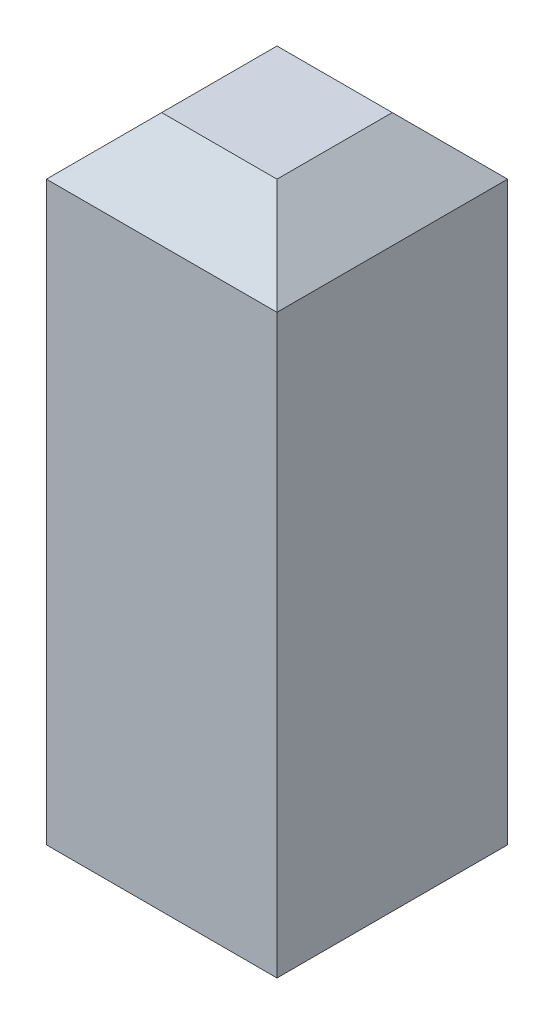
ISO-10303-21;
HEADER;
FILE_DESCRIPTION(('STEP AP214'),'2;1');
FILE_NAME('part.step','',(''),(''),'','','');
FILE_SCHEMA(('AUTOMOTIVE_DESIGN { 1 0 10303 214 1 1 1 1 }'));
ENDSEC;
DATA;
#1=APPLICATION_CONTEXT('core data for automotive mechanical design processes');
#2=APPLICATION_PROTOCOL_DEFINITION('international standard','automotive_design',2000,#1);
#3=PRODUCT_CONTEXT('',#1,'mechanical');
#4=PRODUCT('Part','Part','',(#3));
#5=PRODUCT_RELATED_PRODUCT_CATEGORY('part','',(#4));
#6=PRODUCT_DEFINITION_FORMATION('','',#4);
#7=PRODUCT_DEFINITION_CONTEXT('part definition',#1,'design');
#8=PRODUCT_DEFINITION('design','',#6,#7);
#9=PRODUCT_DEFINITION_SHAPE('','',#8);
#10=(LENGTH_UNIT() NAMED_UNIT(*) SI_UNIT(.MILLI.,.METRE.));
#11=(NAMED_UNIT(*) PLANE_ANGLE_UNIT() SI_UNIT($,.RADIAN.));
#12=(NAMED_UNIT(*) SI_UNIT($,.STERADIAN.) SOLID_ANGLE_UNIT());
#13=UNCERTAINTY_MEASURE_WITH_UNIT(LENGTH_MEASURE(1.E-05),#10,'distance_accuracy_value','');
#14=(GEOMETRIC_REPRESENTATION_CONTEXT(3) GLOBAL_UNCERTAINTY_ASSIGNED_CONTEXT((#13)) GLOBAL_UNIT_ASSIGNED_CONTEXT((#10,
#11,#12)) REPRESENTATION_CONTEXT('',''));
#15=CARTESIAN_POINT('',(0.,0.,0.));
#16=DIRECTION('',(0.,0.,1.));
#17=DIRECTION('',(1.,0.,0.));
#18=AXIS2_PLACEMENT_3D('',#15,#16,#17);
#19=CARTESIAN_POINT('',(2.,12.,2.));
#20=DIRECTION('',(-1.,0.,0.));
#21=DIRECTION('',(0.,0.,1.));
#22=AXIS2_PLACEMENT_3D('',#19,#20,#21);
#23=PLANE('',#22);
#24=DIRECTION('',(0.,-1.,0.));
#25=VECTOR('',#24,1.);
#26=CARTESIAN_POINT('',(2.,12.,2.));
#27=LINE('',#26,#25);
#28=CARTESIAN_POINT('',(2.,11.,2.));
#29=VERTEX_POINT('',#28);
#30=CARTESIAN_POINT('',(2.,0.999999999999999,2.));
#31=VERTEX_POINT('',#30);
#32=EDGE_CURVE('E170',#29,#31,#27,.T.);
#33=ORIENTED_EDGE('',*,*,#32,.T.);
#34=DIRECTION('',(0.,0.,-1.));
#35=VECTOR('',#34,1.);
#36=CARTESIAN_POINT('',(2.,0.999999999999999,-2.));
#37=LINE('',#36,#35);
#38=CARTESIAN_POINT('',(2.,0.999999999999999,-2.));
#39=VERTEX_POINT('',#38);
#40=EDGE_CURVE('E58',#31,#39,#37,.T.);
#41=ORIENTED_EDGE('',*,*,#40,.T.);
#42=DIRECTION('',(0.,-1.,0.));
#43=VECTOR('',#42,1.);
#44=CARTESIAN_POINT('',(2.,12.,-2.));
#45=LINE('',#44,#43);
#46=CARTESIAN_POINT('',(2.,11.,-2.));
#47=VERTEX_POINT('',#46);
#48=EDGE_CURVE('E138',#47,#39,#45,.T.);
#49=ORIENTED_EDGE('',*,*,#48,.F.);
#50=DIRECTION('',(0.,0.,1.));
#51=VECTOR('',#50,1.);
#52=CARTESIAN_POINT('',(2.,11.,2.));
#53=LINE('',#52,#51);
#54=EDGE_CURVE('E158',#47,#29,#53,.T.);
#55=ORIENTED_EDGE('',*,*,#54,.T.);
#56=EDGE_LOOP('',(#33,#41,#49,#55));
#57=FACE_BOUND('',#56,.T.);
#58=ADVANCED_FACE('F47',(#57),#23,.F.);
#59=CARTESIAN_POINT('',(-2.,12.,-2.));
#60=DIRECTION('',(0.,0.,1.));
#61=DIRECTION('',(1.,0.,0.));
#62=AXIS2_PLACEMENT_3D('',#59,#60,#61);
#63=PLANE('',#62);
#64=ORIENTED_EDGE('',*,*,#48,.T.);
#65=DIRECTION('',(-1.,0.,0.));
#66=VECTOR('',#65,1.);
#67=CARTESIAN_POINT('',(-2.,0.999999999999999,-2.));
#68=LINE('',#67,#66);
#69=CARTESIAN_POINT('',(-2.,0.999999999999999,-2.));
#70=VERTEX_POINT('',#69);
#71=EDGE_CURVE('E187',#39,#70,#68,.T.);
#72=ORIENTED_EDGE('',*,*,#71,.T.);
#73=DIRECTION('',(0.,-1.,0.));
#74=VECTOR('',#73,1.);
#75=CARTESIAN_POINT('',(-2.,12.,-2.));
#76=LINE('',#75,#74);
#77=CARTESIAN_POINT('',(-2.,11.,-2.));
#78=VERTEX_POINT('',#77);
#79=EDGE_CURVE('E227',#78,#70,#76,.T.);
#80=ORIENTED_EDGE('',*,*,#79,.F.);
#81=DIRECTION('',(1.,0.,0.));
#82=VECTOR('',#81,1.);
#83=CARTESIAN_POINT('',(-2.,11.,-2.));
#84=LINE('',#83,#82);
#85=EDGE_CURVE('E155',#78,#47,#84,.T.);
#86=ORIENTED_EDGE('',*,*,#85,.T.);
#87=EDGE_LOOP('',(#64,#72,#80,#86));
#88=FACE_BOUND('',#87,.T.);
#89=ADVANCED_FACE('F246',(#88),#63,.F.);
#90=CARTESIAN_POINT('',(-2.,12.,2.));
#91=DIRECTION('',(1.,0.,0.));
#92=DIRECTION('',(0.,0.,-1.));
#93=AXIS2_PLACEMENT_3D('',#90,#91,#92);
#94=PLANE('',#93);
#95=ORIENTED_EDGE('',*,*,#79,.T.);
#96=DIRECTION('',(0.,0.,1.));
#97=VECTOR('',#96,1.);
#98=CARTESIAN_POINT('',(-2.,0.999999999999999,2.));
#99=LINE('',#98,#97);
#100=CARTESIAN_POINT('',(-2.,0.999999999999999,2.));
#101=VERTEX_POINT('',#100);
#102=EDGE_CURVE('E160',#70,#101,#99,.T.);
#103=ORIENTED_EDGE('',*,*,#102,.T.);
#104=DIRECTION('',(0.,-1.,0.));
#105=VECTOR('',#104,1.);
#106=CARTESIAN_POINT('',(-2.,12.,2.));
#107=LINE('',#106,#105);
#108=CARTESIAN_POINT('',(-2.,11.,2.));
#109=VERTEX_POINT('',#108);
#110=EDGE_CURVE('E225',#109,#101,#107,.T.);
#111=ORIENTED_EDGE('',*,*,#110,.F.);
#112=DIRECTION('',(0.,0.,-1.));
#113=VECTOR('',#112,1.);
#114=CARTESIAN_POINT('',(-2.,11.,2.));
#115=LINE('',#114,#113);
#116=EDGE_CURVE('E148',#109,#78,#115,.T.);
#117=ORIENTED_EDGE('',*,*,#116,.T.);
#118=EDGE_LOOP('',(#95,#103,#111,#117));
#119=FACE_BOUND('',#118,.T.);
#120=ADVANCED_FACE('F224',(#119),#94,.F.);
#121=CARTESIAN_POINT('',(-2.,12.,2.));
#122=DIRECTION('',(0.,0.,-1.));
#123=DIRECTION('',(-1.,0.,0.));
#124=AXIS2_PLACEMENT_3D('',#121,#122,#123);
#125=PLANE('',#124);
#126=ORIENTED_EDGE('',*,*,#110,.T.);
#127=DIRECTION('',(1.,0.,0.));
#128=VECTOR('',#127,1.);
#129=CARTESIAN_POINT('',(2.,0.999999999999999,2.));
#130=LINE('',#129,#128);
#131=EDGE_CURVE('E11',#101,#31,#130,.T.);
#132=ORIENTED_EDGE('',*,*,#131,.T.);
#133=ORIENTED_EDGE('',*,*,#32,.F.);
#134=DIRECTION('',(-1.,0.,0.));
#135=VECTOR('',#134,1.);
#136=CARTESIAN_POINT('',(-2.,11.,2.));
#137=LINE('',#136,#135);
#138=EDGE_CURVE('E123',#29,#109,#137,.T.);
#139=ORIENTED_EDGE('',*,*,#138,.T.);
#140=EDGE_LOOP('',(#126,#132,#133,#139));
#141=FACE_BOUND('',#140,.T.);
#142=ADVANCED_FACE('F228',(#141),#125,.F.);
#143=CARTESIAN_POINT('',(0.,12.,0.));
#144=DIRECTION('',(0.,-1.,0.));
#145=DIRECTION('',(0.,0.,-1.));
#146=AXIS2_PLACEMENT_3D('',#143,#144,#145);
#147=PLANE('',#146);
#148=DIRECTION('',(0.,0.,1.));
#149=VECTOR('',#148,1.);
#150=CARTESIAN_POINT('',(-1.,12.,0.));
#151=LINE('',#150,#149);
#152=CARTESIAN_POINT('',(-1.,12.,-1.));
#153=VERTEX_POINT('',#152);
#154=CARTESIAN_POINT('',(-1.,12.,1.));
#155=VERTEX_POINT('',#154);
#156=EDGE_CURVE('E142',#153,#155,#151,.T.);
#157=ORIENTED_EDGE('',*,*,#156,.T.);
#158=DIRECTION('',(1.,0.,0.));
#159=VECTOR('',#158,1.);
#160=CARTESIAN_POINT('',(0.,12.,1.));
#161=LINE('',#160,#159);
#162=CARTESIAN_POINT('',(1.,12.,1.));
#163=VERTEX_POINT('',#162);
#164=EDGE_CURVE('E121',#155,#163,#161,.T.);
#165=ORIENTED_EDGE('',*,*,#164,.T.);
#166=DIRECTION('',(0.,0.,-1.));
#167=VECTOR('',#166,1.);
#168=CARTESIAN_POINT('',(1.,12.,0.));
#169=LINE('',#168,#167);
#170=CARTESIAN_POINT('',(1.,12.,-1.));
#171=VERTEX_POINT('',#170);
#172=EDGE_CURVE('E130',#163,#171,#169,.T.);
#173=ORIENTED_EDGE('',*,*,#172,.T.);
#174=DIRECTION('',(-1.,0.,0.));
#175=VECTOR('',#174,1.);
#176=CARTESIAN_POINT('',(0.,12.,-1.));
#177=LINE('',#176,#175);
#178=EDGE_CURVE('E137',#171,#153,#177,.T.);
#179=ORIENTED_EDGE('',*,*,#178,.T.);
#180=EDGE_LOOP('',(#157,#165,#173,#179));
#181=FACE_BOUND('',#180,.T.);
#182=ADVANCED_FACE('F140',(#181),#147,.F.);
#183=CARTESIAN_POINT('',(0.,0.,0.));
#184=DIRECTION('',(0.,-1.,0.));
#185=DIRECTION('',(0.,0.,-1.));
#186=AXIS2_PLACEMENT_3D('',#183,#184,#185);
#187=PLANE('',#186);
#188=DIRECTION('',(-1.,0.,0.));
#189=VECTOR('',#188,1.);
#190=CARTESIAN_POINT('',(-2.,0.,0.999999999999997));
#191=LINE('',#190,#189);
#192=CARTESIAN_POINT('',(0.999999999999997,0.,0.999999999999997));
#193=VERTEX_POINT('',#192);
#194=CARTESIAN_POINT('',(-0.999999999999997,0.,0.999999999999997));
#195=VERTEX_POINT('',#194);
#196=EDGE_CURVE('E174',#193,#195,#191,.T.);
#197=ORIENTED_EDGE('',*,*,#196,.T.);
#198=DIRECTION('',(0.,0.,-1.));
#199=VECTOR('',#198,1.);
#200=CARTESIAN_POINT('',(-0.999999999999997,0.,-2.));
#201=LINE('',#200,#199);
#202=CARTESIAN_POINT('',(-0.999999999999997,0.,-0.999999999999997));
#203=VERTEX_POINT('',#202);
#204=EDGE_CURVE('E183',#195,#203,#201,.T.);
#205=ORIENTED_EDGE('',*,*,#204,.T.);
#206=DIRECTION('',(1.,0.,0.));
#207=VECTOR('',#206,1.);
#208=CARTESIAN_POINT('',(2.,0.,-0.999999999999997));
#209=LINE('',#208,#207);
#210=CARTESIAN_POINT('',(0.999999999999997,0.,-0.999999999999997));
#211=VERTEX_POINT('',#210);
#212=EDGE_CURVE('E180',#203,#211,#209,.T.);
#213=ORIENTED_EDGE('',*,*,#212,.T.);
#214=DIRECTION('',(0.,0.,1.));
#215=VECTOR('',#214,1.);
#216=CARTESIAN_POINT('',(0.999999999999997,0.,2.));
#217=LINE('',#216,#215);
#218=EDGE_CURVE('E177',#211,#193,#217,.T.);
#219=ORIENTED_EDGE('',*,*,#218,.T.);
#220=EDGE_LOOP('',(#197,#205,#213,#219));
#221=FACE_BOUND('',#220,.T.);
#222=ADVANCED_FACE('F214',(#221),#187,.T.);
#223=CARTESIAN_POINT('',(0.,12.,-1.));
#224=DIRECTION('',(0.,-0.707106781186546,0.707106781186549));
#225=DIRECTION('',(-1.,0.,0.));
#226=AXIS2_PLACEMENT_3D('',#223,#224,#225);
#227=PLANE('',#226);
#228=DIRECTION('',(-0.577350269189625,0.577350269189627,0.577350269189625));
#229=VECTOR('',#228,1.);
#230=CARTESIAN_POINT('',(0.666666666666668,12.3333333333333,-0.666666666666668));
#231=LINE('',#230,#229);
#232=EDGE_CURVE('E133',#47,#171,#231,.T.);
#233=ORIENTED_EDGE('',*,*,#232,.F.);
#234=ORIENTED_EDGE('',*,*,#85,.F.);
#235=DIRECTION('',(0.577350269189625,0.577350269189627,0.577350269189625));
#236=VECTOR('',#235,1.);
#237=CARTESIAN_POINT('',(-0.666666666666668,12.3333333333333,-0.666666666666668));
#238=LINE('',#237,#236);
#239=EDGE_CURVE('E166',#153,#78,#238,.F.);
#240=ORIENTED_EDGE('',*,*,#239,.F.);
#241=ORIENTED_EDGE('',*,*,#178,.F.);
#242=EDGE_LOOP('',(#233,#234,#240,#241));
#243=FACE_BOUND('',#242,.T.);
#244=ADVANCED_FACE('F241',(#243),#227,.F.);
#245=CARTESIAN_POINT('',(-1.,12.,0.));
#246=DIRECTION('',(0.707106781186549,-0.707106781186546,0.));
#247=DIRECTION('',(0.,0.,1.));
#248=AXIS2_PLACEMENT_3D('',#245,#246,#247);
#249=PLANE('',#248);
#250=ORIENTED_EDGE('',*,*,#239,.T.);
#251=ORIENTED_EDGE('',*,*,#116,.F.);
#252=DIRECTION('',(0.577350269189625,0.577350269189627,-0.577350269189625));
#253=VECTOR('',#252,1.);
#254=CARTESIAN_POINT('',(-0.666666666666668,12.3333333333333,0.666666666666668));
#255=LINE('',#254,#253);
#256=EDGE_CURVE('E127',#155,#109,#255,.F.);
#257=ORIENTED_EDGE('',*,*,#256,.F.);
#258=ORIENTED_EDGE('',*,*,#156,.F.);
#259=EDGE_LOOP('',(#250,#251,#257,#258));
#260=FACE_BOUND('',#259,.T.);
#261=ADVANCED_FACE('F244',(#260),#249,.F.);
#262=CARTESIAN_POINT('',(1.,12.,0.));
#263=DIRECTION('',(-0.707106781186549,-0.707106781186546,0.));
#264=DIRECTION('',(0.,0.,-1.));
#265=AXIS2_PLACEMENT_3D('',#262,#263,#264);
#266=PLANE('',#265);
#267=ORIENTED_EDGE('',*,*,#232,.T.);
#268=ORIENTED_EDGE('',*,*,#172,.F.);
#269=DIRECTION('',(0.577350269189625,-0.577350269189627,0.577350269189625));
#270=VECTOR('',#269,1.);
#271=CARTESIAN_POINT('',(0.666666666666668,12.3333333333333,0.666666666666668));
#272=LINE('',#271,#270);
#273=EDGE_CURVE('E117',#29,#163,#272,.F.);
#274=ORIENTED_EDGE('',*,*,#273,.F.);
#275=ORIENTED_EDGE('',*,*,#54,.F.);
#276=EDGE_LOOP('',(#267,#268,#274,#275));
#277=FACE_BOUND('',#276,.T.);
#278=ADVANCED_FACE('F131',(#277),#266,.F.);
#279=CARTESIAN_POINT('',(0.,12.,1.));
#280=DIRECTION('',(0.,-0.707106781186546,-0.707106781186549));
#281=DIRECTION('',(1.,0.,0.));
#282=AXIS2_PLACEMENT_3D('',#279,#280,#281);
#283=PLANE('',#282);
#284=ORIENTED_EDGE('',*,*,#256,.T.);
#285=ORIENTED_EDGE('',*,*,#138,.F.);
#286=ORIENTED_EDGE('',*,*,#273,.T.);
#287=ORIENTED_EDGE('',*,*,#164,.F.);
#288=EDGE_LOOP('',(#284,#285,#286,#287));
#289=FACE_BOUND('',#288,.T.);
#290=ADVANCED_FACE('F119',(#289),#283,.F.);
#291=CARTESIAN_POINT('',(2.,0.999999999999999,2.));
#292=DIRECTION('',(0.707106781186546,-0.707106781186549,0.));
#293=DIRECTION('',(0.,0.,1.));
#294=AXIS2_PLACEMENT_3D('',#291,#292,#293);
#295=PLANE('',#294);
#296=DIRECTION('',(0.577350269189626,0.577350269189624,0.577350269189626));
#297=VECTOR('',#296,1.);
#298=CARTESIAN_POINT('',(0.666666666666663,-0.333333333333333,0.666666666666663));
#299=LINE('',#298,#297);
#300=EDGE_CURVE('E197',#193,#31,#299,.T.);
#301=ORIENTED_EDGE('',*,*,#300,.F.);
#302=ORIENTED_EDGE('',*,*,#218,.F.);
#303=DIRECTION('',(0.577350269189626,0.577350269189624,-0.577350269189626));
#304=VECTOR('',#303,1.);
#305=CARTESIAN_POINT('',(0.666666666666664,-0.333333333333333,-0.666666666666664));
#306=LINE('',#305,#304);
#307=EDGE_CURVE('E52',#39,#211,#306,.F.);
#308=ORIENTED_EDGE('',*,*,#307,.F.);
#309=ORIENTED_EDGE('',*,*,#40,.F.);
#310=EDGE_LOOP('',(#301,#302,#308,#309));
#311=FACE_BOUND('',#310,.T.);
#312=ADVANCED_FACE('F50',(#311),#295,.T.);
#313=CARTESIAN_POINT('',(-2.,0.999999999999999,-2.));
#314=DIRECTION('',(0.,-0.707106781186549,-0.707106781186546));
#315=DIRECTION('',(1.,0.,0.));
#316=AXIS2_PLACEMENT_3D('',#313,#314,#315);
#317=PLANE('',#316);
#318=ORIENTED_EDGE('',*,*,#307,.T.);
#319=ORIENTED_EDGE('',*,*,#212,.F.);
#320=DIRECTION('',(-0.577350269189626,0.577350269189624,-0.577350269189626));
#321=VECTOR('',#320,1.);
#322=CARTESIAN_POINT('',(-2.,0.999999999999999,-2.));
#323=LINE('',#322,#321);
#324=EDGE_CURVE('E195',#70,#203,#323,.F.);
#325=ORIENTED_EDGE('',*,*,#324,.F.);
#326=ORIENTED_EDGE('',*,*,#71,.F.);
#327=EDGE_LOOP('',(#318,#319,#325,#326));
#328=FACE_BOUND('',#327,.T.);
#329=ADVANCED_FACE('F209',(#328),#317,.T.);
#330=CARTESIAN_POINT('',(-2.,0.999999999999999,2.));
#331=DIRECTION('',(0.,-0.707106781186549,0.707106781186546));
#332=DIRECTION('',(-1.,0.,0.));
#333=AXIS2_PLACEMENT_3D('',#330,#331,#332);
#334=PLANE('',#333);
#335=ORIENTED_EDGE('',*,*,#300,.T.);
#336=ORIENTED_EDGE('',*,*,#131,.F.);
#337=DIRECTION('',(0.577350269189626,-0.577350269189624,-0.577350269189626));
#338=VECTOR('',#337,1.);
#339=CARTESIAN_POINT('',(-2.,0.999999999999999,2.));
#340=LINE('',#339,#338);
#341=EDGE_CURVE('E192',#195,#101,#340,.F.);
#342=ORIENTED_EDGE('',*,*,#341,.F.);
#343=ORIENTED_EDGE('',*,*,#196,.F.);
#344=EDGE_LOOP('',(#335,#336,#342,#343));
#345=FACE_BOUND('',#344,.T.);
#346=ADVANCED_FACE('F220',(#345),#334,.T.);
#347=CARTESIAN_POINT('',(-2.,0.999999999999999,2.));
#348=DIRECTION('',(-0.707106781186546,-0.707106781186549,0.));
#349=DIRECTION('',(0.,0.,-1.));
#350=AXIS2_PLACEMENT_3D('',#347,#348,#349);
#351=PLANE('',#350);
#352=ORIENTED_EDGE('',*,*,#324,.T.);
#353=ORIENTED_EDGE('',*,*,#204,.F.);
#354=ORIENTED_EDGE('',*,*,#341,.T.);
#355=ORIENTED_EDGE('',*,*,#102,.F.);
#356=EDGE_LOOP('',(#352,#353,#354,#355));
#357=FACE_BOUND('',#356,.T.);
#358=ADVANCED_FACE('F218',(#357),#351,.T.);
#359=CLOSED_SHELL('',(#58,#89,#120,#142,#182,#222,#244,#261,#278,#290,#312,#329,#346,#358));
#360=MANIFOLD_SOLID_BREP('B2',#359);
#361=ADVANCED_BREP_SHAPE_REPRESENTATION('',(#18,#360),#14);
#362=SHAPE_DEFINITION_REPRESENTATION(#9,#361);
ENDSEC;
END-ISO-10303-21;
